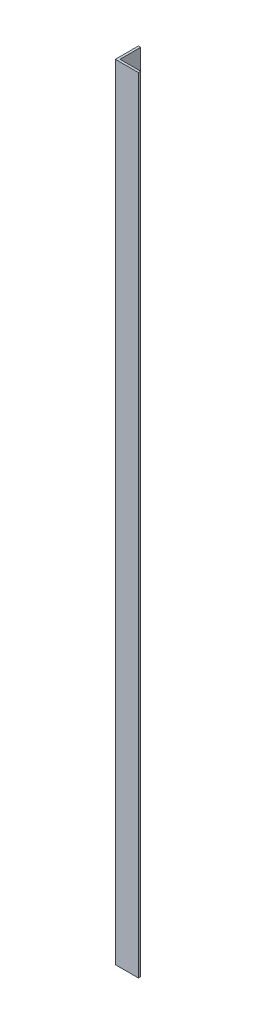
ISO-10303-21;
HEADER;
FILE_DESCRIPTION(('STEP AP214'),'2;1');
FILE_NAME('part.step','',(''),(''),'','','');
FILE_SCHEMA(('AUTOMOTIVE_DESIGN { 1 0 10303 214 1 1 1 1 }'));
ENDSEC;
DATA;
#1=APPLICATION_CONTEXT('core data for automotive mechanical design processes');
#2=APPLICATION_PROTOCOL_DEFINITION('international standard','automotive_design',2000,#1);
#3=PRODUCT_CONTEXT('',#1,'mechanical');
#4=PRODUCT('Part','Part','',(#3));
#5=PRODUCT_RELATED_PRODUCT_CATEGORY('part','',(#4));
#6=PRODUCT_DEFINITION_FORMATION('','',#4);
#7=PRODUCT_DEFINITION_CONTEXT('part definition',#1,'design');
#8=PRODUCT_DEFINITION('design','',#6,#7);
#9=PRODUCT_DEFINITION_SHAPE('','',#8);
#10=(LENGTH_UNIT() NAMED_UNIT(*) SI_UNIT(.MILLI.,.METRE.));
#11=(NAMED_UNIT(*) PLANE_ANGLE_UNIT() SI_UNIT($,.RADIAN.));
#12=(NAMED_UNIT(*) SI_UNIT($,.STERADIAN.) SOLID_ANGLE_UNIT());
#13=UNCERTAINTY_MEASURE_WITH_UNIT(LENGTH_MEASURE(1.E-05),#10,'distance_accuracy_value','');
#14=(GEOMETRIC_REPRESENTATION_CONTEXT(3) GLOBAL_UNCERTAINTY_ASSIGNED_CONTEXT((#13)) GLOBAL_UNIT_ASSIGNED_CONTEXT((#10,
#11,#12)) REPRESENTATION_CONTEXT('',''));
#15=CARTESIAN_POINT('',(0.,0.,0.));
#16=DIRECTION('',(0.,0.,1.));
#17=DIRECTION('',(1.,0.,0.));
#18=AXIS2_PLACEMENT_3D('',#15,#16,#17);
#19=CARTESIAN_POINT('',(63.5,2165.35,0.));
#20=DIRECTION('',(0.,0.,-1.));
#21=DIRECTION('',(-1.,0.,0.));
#22=AXIS2_PLACEMENT_3D('',#19,#20,#21);
#23=PLANE('',#22);
#24=DIRECTION('',(1.,0.,0.));
#25=VECTOR('',#24,1.);
#26=CARTESIAN_POINT('',(63.5,0.,0.));
#27=LINE('',#26,#25);
#28=CARTESIAN_POINT('',(0.,0.,0.));
#29=VERTEX_POINT('',#28);
#30=CARTESIAN_POINT('',(63.5,0.,0.));
#31=VERTEX_POINT('',#30);
#32=EDGE_CURVE('E118',#29,#31,#27,.T.);
#33=ORIENTED_EDGE('',*,*,#32,.T.);
#34=DIRECTION('',(0.,-1.,0.));
#35=VECTOR('',#34,1.);
#36=CARTESIAN_POINT('',(63.5,2165.35,0.));
#37=LINE('',#36,#35);
#38=CARTESIAN_POINT('',(63.5,2165.35,0.));
#39=VERTEX_POINT('',#38);
#40=EDGE_CURVE('E11',#39,#31,#37,.T.);
#41=ORIENTED_EDGE('',*,*,#40,.F.);
#42=DIRECTION('',(1.,0.,0.));
#43=VECTOR('',#42,1.);
#44=CARTESIAN_POINT('',(63.5,2165.35,0.));
#45=LINE('',#44,#43);
#46=CARTESIAN_POINT('',(0.,2165.35,0.));
#47=VERTEX_POINT('',#46);
#48=EDGE_CURVE('E128',#47,#39,#45,.T.);
#49=ORIENTED_EDGE('',*,*,#48,.F.);
#50=DIRECTION('',(0.,-1.,0.));
#51=VECTOR('',#50,1.);
#52=CARTESIAN_POINT('',(0.,2165.35,0.));
#53=LINE('',#52,#51);
#54=EDGE_CURVE('E114',#47,#29,#53,.T.);
#55=ORIENTED_EDGE('',*,*,#54,.T.);
#56=EDGE_LOOP('',(#33,#41,#49,#55));
#57=FACE_BOUND('',#56,.T.);
#58=ADVANCED_FACE('F34',(#57),#23,.F.);
#59=CARTESIAN_POINT('',(63.5,2165.35,-6.35));
#60=DIRECTION('',(-1.,0.,0.));
#61=DIRECTION('',(0.,0.,1.));
#62=AXIS2_PLACEMENT_3D('',#59,#60,#61);
#63=PLANE('',#62);
#64=DIRECTION('',(0.,0.,-1.));
#65=VECTOR('',#64,1.);
#66=CARTESIAN_POINT('',(63.5,0.,-6.35));
#67=LINE('',#66,#65);
#68=CARTESIAN_POINT('',(63.5,0.,-6.35));
#69=VERTEX_POINT('',#68);
#70=EDGE_CURVE('E121',#31,#69,#67,.T.);
#71=ORIENTED_EDGE('',*,*,#70,.T.);
#72=DIRECTION('',(0.,-1.,0.));
#73=VECTOR('',#72,1.);
#74=CARTESIAN_POINT('',(63.5,2165.35,-6.35));
#75=LINE('',#74,#73);
#76=CARTESIAN_POINT('',(63.5,2165.35,-6.35));
#77=VERTEX_POINT('',#76);
#78=EDGE_CURVE('E42',#77,#69,#75,.T.);
#79=ORIENTED_EDGE('',*,*,#78,.F.);
#80=DIRECTION('',(0.,0.,-1.));
#81=VECTOR('',#80,1.);
#82=CARTESIAN_POINT('',(63.5,2165.35,-6.35));
#83=LINE('',#82,#81);
#84=EDGE_CURVE('E87',#39,#77,#83,.T.);
#85=ORIENTED_EDGE('',*,*,#84,.F.);
#86=ORIENTED_EDGE('',*,*,#40,.T.);
#87=EDGE_LOOP('',(#71,#79,#85,#86));
#88=FACE_BOUND('',#87,.T.);
#89=ADVANCED_FACE('F152',(#88),#63,.F.);
#90=CARTESIAN_POINT('',(6.35000000000001,2165.35,-6.35));
#91=DIRECTION('',(0.,0.,1.));
#92=DIRECTION('',(1.,0.,0.));
#93=AXIS2_PLACEMENT_3D('',#90,#91,#92);
#94=PLANE('',#93);
#95=DIRECTION('',(-1.,0.,0.));
#96=VECTOR('',#95,1.);
#97=CARTESIAN_POINT('',(6.35000000000001,0.,-6.35));
#98=LINE('',#97,#96);
#99=CARTESIAN_POINT('',(6.35000000000001,0.,-6.35));
#100=VERTEX_POINT('',#99);
#101=EDGE_CURVE('E123',#69,#100,#98,.T.);
#102=ORIENTED_EDGE('',*,*,#101,.T.);
#103=DIRECTION('',(0.,-1.,0.));
#104=VECTOR('',#103,1.);
#105=CARTESIAN_POINT('',(6.35000000000001,2165.35,-6.35));
#106=LINE('',#105,#104);
#107=CARTESIAN_POINT('',(6.35000000000001,2165.35,-6.35));
#108=VERTEX_POINT('',#107);
#109=EDGE_CURVE('E109',#108,#100,#106,.T.);
#110=ORIENTED_EDGE('',*,*,#109,.F.);
#111=DIRECTION('',(-1.,0.,0.));
#112=VECTOR('',#111,1.);
#113=CARTESIAN_POINT('',(6.35000000000001,2165.35,-6.35));
#114=LINE('',#113,#112);
#115=EDGE_CURVE('E100',#77,#108,#114,.T.);
#116=ORIENTED_EDGE('',*,*,#115,.F.);
#117=ORIENTED_EDGE('',*,*,#78,.T.);
#118=EDGE_LOOP('',(#102,#110,#116,#117));
#119=FACE_BOUND('',#118,.T.);
#120=ADVANCED_FACE('F134',(#119),#94,.F.);
#121=CARTESIAN_POINT('',(6.35,2165.35,-63.5));
#122=DIRECTION('',(-1.,0.,0.));
#123=DIRECTION('',(0.,0.,1.));
#124=AXIS2_PLACEMENT_3D('',#121,#122,#123);
#125=PLANE('',#124);
#126=DIRECTION('',(0.,0.,-1.));
#127=VECTOR('',#126,1.);
#128=CARTESIAN_POINT('',(6.35,0.,-63.5));
#129=LINE('',#128,#127);
#130=CARTESIAN_POINT('',(6.35,0.,-63.5));
#131=VERTEX_POINT('',#130);
#132=EDGE_CURVE('E108',#100,#131,#129,.T.);
#133=ORIENTED_EDGE('',*,*,#132,.T.);
#134=DIRECTION('',(0.,-1.,0.));
#135=VECTOR('',#134,1.);
#136=CARTESIAN_POINT('',(6.35,2165.35,-63.5));
#137=LINE('',#136,#135);
#138=CARTESIAN_POINT('',(6.35,2165.35,-63.5));
#139=VERTEX_POINT('',#138);
#140=EDGE_CURVE('E105',#139,#131,#137,.T.);
#141=ORIENTED_EDGE('',*,*,#140,.F.);
#142=DIRECTION('',(0.,0.,-1.));
#143=VECTOR('',#142,1.);
#144=CARTESIAN_POINT('',(6.35,2165.35,-63.5));
#145=LINE('',#144,#143);
#146=EDGE_CURVE('E94',#108,#139,#145,.T.);
#147=ORIENTED_EDGE('',*,*,#146,.F.);
#148=ORIENTED_EDGE('',*,*,#109,.T.);
#149=EDGE_LOOP('',(#133,#141,#147,#148));
#150=FACE_BOUND('',#149,.T.);
#151=ADVANCED_FACE('F106',(#150),#125,.F.);
#152=CARTESIAN_POINT('',(0.,2165.35,-63.5));
#153=DIRECTION('',(0.,0.,1.));
#154=DIRECTION('',(1.,0.,0.));
#155=AXIS2_PLACEMENT_3D('',#152,#153,#154);
#156=PLANE('',#155);
#157=DIRECTION('',(-1.,0.,0.));
#158=VECTOR('',#157,1.);
#159=CARTESIAN_POINT('',(0.,0.,-63.5));
#160=LINE('',#159,#158);
#161=CARTESIAN_POINT('',(0.,0.,-63.5));
#162=VERTEX_POINT('',#161);
#163=EDGE_CURVE('E73',#131,#162,#160,.T.);
#164=ORIENTED_EDGE('',*,*,#163,.T.);
#165=DIRECTION('',(0.,-1.,0.));
#166=VECTOR('',#165,1.);
#167=CARTESIAN_POINT('',(0.,2165.35,-63.5));
#168=LINE('',#167,#166);
#169=CARTESIAN_POINT('',(0.,2165.35,-63.5));
#170=VERTEX_POINT('',#169);
#171=EDGE_CURVE('E110',#170,#162,#168,.T.);
#172=ORIENTED_EDGE('',*,*,#171,.F.);
#173=DIRECTION('',(-1.,0.,0.));
#174=VECTOR('',#173,1.);
#175=CARTESIAN_POINT('',(0.,2165.35,-63.5));
#176=LINE('',#175,#174);
#177=EDGE_CURVE('E98',#139,#170,#176,.T.);
#178=ORIENTED_EDGE('',*,*,#177,.F.);
#179=ORIENTED_EDGE('',*,*,#140,.T.);
#180=EDGE_LOOP('',(#164,#172,#178,#179));
#181=FACE_BOUND('',#180,.T.);
#182=ADVANCED_FACE('F112',(#181),#156,.F.);
#183=CARTESIAN_POINT('',(0.,2165.35,0.));
#184=DIRECTION('',(1.,0.,0.));
#185=DIRECTION('',(0.,0.,-1.));
#186=AXIS2_PLACEMENT_3D('',#183,#184,#185);
#187=PLANE('',#186);
#188=DIRECTION('',(0.,0.,1.));
#189=VECTOR('',#188,1.);
#190=CARTESIAN_POINT('',(0.,0.,0.));
#191=LINE('',#190,#189);
#192=EDGE_CURVE('E79',#162,#29,#191,.T.);
#193=ORIENTED_EDGE('',*,*,#192,.T.);
#194=ORIENTED_EDGE('',*,*,#54,.F.);
#195=DIRECTION('',(0.,0.,1.));
#196=VECTOR('',#195,1.);
#197=CARTESIAN_POINT('',(0.,2165.35,0.));
#198=LINE('',#197,#196);
#199=EDGE_CURVE('E50',#170,#47,#198,.T.);
#200=ORIENTED_EDGE('',*,*,#199,.F.);
#201=ORIENTED_EDGE('',*,*,#171,.T.);
#202=EDGE_LOOP('',(#193,#194,#200,#201));
#203=FACE_BOUND('',#202,.T.);
#204=ADVANCED_FACE('F141',(#203),#187,.F.);
#205=CARTESIAN_POINT('',(0.,2165.35,0.));
#206=DIRECTION('',(0.,-1.,0.));
#207=DIRECTION('',(0.,0.,-1.));
#208=AXIS2_PLACEMENT_3D('',#205,#206,#207);
#209=PLANE('',#208);
#210=ORIENTED_EDGE('',*,*,#48,.T.);
#211=ORIENTED_EDGE('',*,*,#84,.T.);
#212=ORIENTED_EDGE('',*,*,#115,.T.);
#213=ORIENTED_EDGE('',*,*,#146,.T.);
#214=ORIENTED_EDGE('',*,*,#177,.T.);
#215=ORIENTED_EDGE('',*,*,#199,.T.);
#216=EDGE_LOOP('',(#210,#211,#212,#213,#214,#215));
#217=FACE_BOUND('',#216,.T.);
#218=ADVANCED_FACE('F96',(#217),#209,.F.);
#219=CARTESIAN_POINT('',(0.,0.,0.));
#220=DIRECTION('',(0.,-1.,0.));
#221=DIRECTION('',(0.,0.,-1.));
#222=AXIS2_PLACEMENT_3D('',#219,#220,#221);
#223=PLANE('',#222);
#224=ORIENTED_EDGE('',*,*,#32,.F.);
#225=ORIENTED_EDGE('',*,*,#192,.F.);
#226=ORIENTED_EDGE('',*,*,#163,.F.);
#227=ORIENTED_EDGE('',*,*,#132,.F.);
#228=ORIENTED_EDGE('',*,*,#101,.F.);
#229=ORIENTED_EDGE('',*,*,#70,.F.);
#230=EDGE_LOOP('',(#224,#225,#226,#227,#228,#229));
#231=FACE_BOUND('',#230,.T.);
#232=ADVANCED_FACE('F137',(#231),#223,.T.);
#233=CLOSED_SHELL('',(#58,#89,#120,#151,#182,#204,#218,#232));
#234=MANIFOLD_SOLID_BREP('B2',#233);
#235=ADVANCED_BREP_SHAPE_REPRESENTATION('',(#18,#234),#14);
#236=SHAPE_DEFINITION_REPRESENTATION(#9,#235);
ENDSEC;
END-ISO-10303-21;
